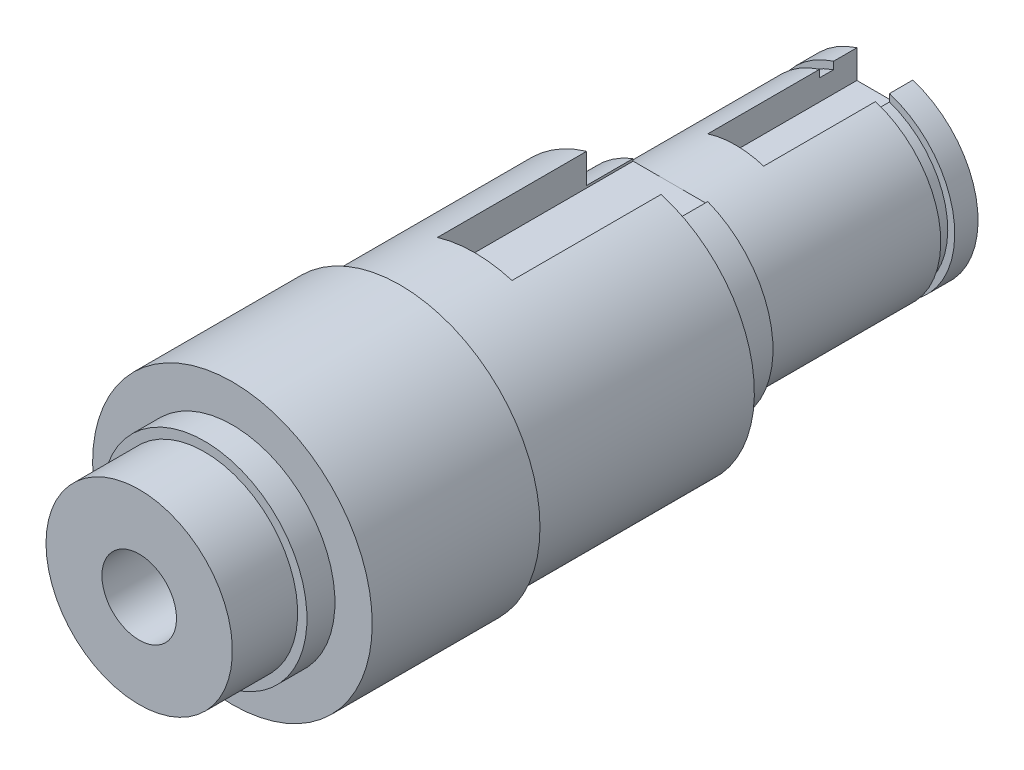
ISO-10303-21;
HEADER;
FILE_DESCRIPTION(('STEP AP214'),'2;1');
FILE_NAME('part.step','',(''),(''),'','','');
FILE_SCHEMA(('AUTOMOTIVE_DESIGN { 1 0 10303 214 1 1 1 1 }'));
ENDSEC;
DATA;
#1=APPLICATION_CONTEXT('core data for automotive mechanical design processes');
#2=APPLICATION_PROTOCOL_DEFINITION('international standard','automotive_design',2000,#1);
#3=PRODUCT_CONTEXT('',#1,'mechanical');
#4=PRODUCT('Part','Part','',(#3));
#5=PRODUCT_RELATED_PRODUCT_CATEGORY('part','',(#4));
#6=PRODUCT_DEFINITION_FORMATION('','',#4);
#7=PRODUCT_DEFINITION_CONTEXT('part definition',#1,'design');
#8=PRODUCT_DEFINITION('design','',#6,#7);
#9=PRODUCT_DEFINITION_SHAPE('','',#8);
#10=(LENGTH_UNIT() NAMED_UNIT(*) SI_UNIT(.MILLI.,.METRE.));
#11=(NAMED_UNIT(*) PLANE_ANGLE_UNIT() SI_UNIT($,.RADIAN.));
#12=(NAMED_UNIT(*) SI_UNIT($,.STERADIAN.) SOLID_ANGLE_UNIT());
#13=UNCERTAINTY_MEASURE_WITH_UNIT(LENGTH_MEASURE(1.E-05),#10,'distance_accuracy_value','');
#14=(GEOMETRIC_REPRESENTATION_CONTEXT(3) GLOBAL_UNCERTAINTY_ASSIGNED_CONTEXT((#13)) GLOBAL_UNIT_ASSIGNED_CONTEXT((#10,
#11,#12)) REPRESENTATION_CONTEXT('',''));
#15=CARTESIAN_POINT('',(0.,0.,0.));
#16=DIRECTION('',(0.,0.,1.));
#17=DIRECTION('',(1.,0.,0.));
#18=AXIS2_PLACEMENT_3D('',#15,#16,#17);
#19=CARTESIAN_POINT('',(0.,0.,-122.779357785201));
#20=DIRECTION('',(0.,0.,-1.));
#21=DIRECTION('',(-1.,0.,0.));
#22=AXIS2_PLACEMENT_3D('',#19,#20,#21);
#23=CYLINDRICAL_SURFACE('',#22,10.);
#24=CARTESIAN_POINT('',(0.,0.,-57.));
#25=DIRECTION('',(0.,0.,-1.));
#26=DIRECTION('',(-1.,0.,0.));
#27=AXIS2_PLACEMENT_3D('',#24,#25,#26);
#28=CIRCLE('',#27,10.);
#29=CARTESIAN_POINT('',(0.,10.,-57.));
#30=VERTEX_POINT('',#29);
#31=EDGE_CURVE('E279',#30,#30,#28,.T.);
#32=ORIENTED_EDGE('',*,*,#31,.T.);
#33=EDGE_LOOP('',(#32));
#34=FACE_BOUND('',#33,.T.);
#35=DIRECTION('',(0.,0.,-1.));
#36=VECTOR('',#35,1.);
#37=CARTESIAN_POINT('',(-3.,9.53939201416947,-64.));
#38=LINE('',#37,#36);
#39=CARTESIAN_POINT('',(-3.,9.53939201416947,-64.));
#40=VERTEX_POINT('',#39);
#41=CARTESIAN_POINT('',(-3.,9.53939201416946,-76.));
#42=VERTEX_POINT('',#41);
#43=EDGE_CURVE('E201',#40,#42,#38,.T.);
#44=ORIENTED_EDGE('',*,*,#43,.T.);
#45=CARTESIAN_POINT('',(0.,0.,-76.));
#46=DIRECTION('',(0.,0.,1.));
#47=DIRECTION('',(1.,0.,0.));
#48=AXIS2_PLACEMENT_3D('',#45,#46,#47);
#49=CIRCLE('',#48,10.);
#50=CARTESIAN_POINT('',(3.,9.53939201416946,-76.));
#51=VERTEX_POINT('',#50);
#52=EDGE_CURVE('E329',#42,#51,#49,.T.);
#53=ORIENTED_EDGE('',*,*,#52,.T.);
#54=DIRECTION('',(0.,0.,-1.));
#55=VECTOR('',#54,1.);
#56=CARTESIAN_POINT('',(3.,9.53939201416947,-64.));
#57=LINE('',#56,#55);
#58=CARTESIAN_POINT('',(3.,9.53939201416947,-64.));
#59=VERTEX_POINT('',#58);
#60=EDGE_CURVE('E196',#59,#51,#57,.T.);
#61=ORIENTED_EDGE('',*,*,#60,.F.);
#62=CARTESIAN_POINT('',(0.,0.,-64.));
#63=DIRECTION('',(0.,0.,-1.));
#64=DIRECTION('',(-1.,0.,0.));
#65=AXIS2_PLACEMENT_3D('',#62,#63,#64);
#66=CIRCLE('',#65,10.);
#67=EDGE_CURVE('E186',#40,#59,#66,.T.);
#68=ORIENTED_EDGE('',*,*,#67,.F.);
#69=EDGE_LOOP('',(#44,#53,#61,#68));
#70=FACE_BOUND('',#69,.T.);
#71=ADVANCED_FACE('F39',(#34,#70),#23,.T.);
#72=CARTESIAN_POINT('',(10.,0.,-80.));
#73=DIRECTION('',(0.,0.,1.));
#74=DIRECTION('',(1.,0.,0.));
#75=AXIS2_PLACEMENT_3D('',#72,#73,#74);
#76=PLANE('',#75);
#77=CARTESIAN_POINT('',(0.,0.,-80.));
#78=DIRECTION('',(0.,0.,-1.));
#79=DIRECTION('',(-1.,0.,0.));
#80=AXIS2_PLACEMENT_3D('',#77,#78,#79);
#81=CIRCLE('',#80,4.);
#82=CARTESIAN_POINT('',(-4.,0.,-80.));
#83=VERTEX_POINT('',#82);
#84=EDGE_CURVE('E287',#83,#83,#81,.T.);
#85=ORIENTED_EDGE('',*,*,#84,.F.);
#86=EDGE_LOOP('',(#85));
#87=FACE_BOUND('',#86,.T.);
#88=DIRECTION('',(0.,1.,0.));
#89=VECTOR('',#88,1.);
#90=CARTESIAN_POINT('',(3.,0.,-80.));
#91=LINE('',#90,#89);
#92=CARTESIAN_POINT('',(3.,6.5,-80.));
#93=VERTEX_POINT('',#92);
#94=CARTESIAN_POINT('',(3.,9.53939201416947,-80.));
#95=VERTEX_POINT('',#94);
#96=EDGE_CURVE('E168',#93,#95,#91,.T.);
#97=ORIENTED_EDGE('',*,*,#96,.T.);
#98=CARTESIAN_POINT('',(0.,0.,-80.));
#99=DIRECTION('',(0.,0.,-1.));
#100=DIRECTION('',(-1.,0.,0.));
#101=AXIS2_PLACEMENT_3D('',#98,#99,#100);
#102=CIRCLE('',#101,10.);
#103=CARTESIAN_POINT('',(-3.,9.53939201416947,-80.));
#104=VERTEX_POINT('',#103);
#105=EDGE_CURVE('E283',#95,#104,#102,.T.);
#106=ORIENTED_EDGE('',*,*,#105,.T.);
#107=DIRECTION('',(0.,1.,0.));
#108=VECTOR('',#107,1.);
#109=CARTESIAN_POINT('',(-3.,0.,-80.));
#110=LINE('',#109,#108);
#111=CARTESIAN_POINT('',(-3.,6.5,-80.));
#112=VERTEX_POINT('',#111);
#113=EDGE_CURVE('E181',#112,#104,#110,.T.);
#114=ORIENTED_EDGE('',*,*,#113,.F.);
#115=DIRECTION('',(-1.,0.,0.));
#116=VECTOR('',#115,1.);
#117=CARTESIAN_POINT('',(0.,6.5,-80.));
#118=LINE('',#117,#116);
#119=EDGE_CURVE('E173',#93,#112,#118,.T.);
#120=ORIENTED_EDGE('',*,*,#119,.F.);
#121=EDGE_LOOP('',(#97,#106,#114,#120));
#122=FACE_BOUND('',#121,.T.);
#123=ADVANCED_FACE('F357',(#87,#122),#76,.F.);
#124=CARTESIAN_POINT('',(3.,9.53939201416946,-77.5));
#125=VERTEX_POINT('',#124);
#126=EDGE_CURVE('E200',#125,#95,#57,.T.);
#127=ORIENTED_EDGE('',*,*,#126,.F.);
#128=CARTESIAN_POINT('',(0.,0.,-77.5));
#129=DIRECTION('',(0.,0.,1.));
#130=DIRECTION('',(1.,0.,0.));
#131=AXIS2_PLACEMENT_3D('',#128,#129,#130);
#132=CIRCLE('',#131,10.);
#133=CARTESIAN_POINT('',(-3.,9.53939201416946,-77.5));
#134=VERTEX_POINT('',#133);
#135=EDGE_CURVE('E147',#134,#125,#132,.T.);
#136=ORIENTED_EDGE('',*,*,#135,.F.);
#137=EDGE_CURVE('E205',#134,#104,#38,.T.);
#138=ORIENTED_EDGE('',*,*,#137,.T.);
#139=ORIENTED_EDGE('',*,*,#105,.F.);
#140=EDGE_LOOP('',(#127,#136,#138,#139));
#141=FACE_BOUND('',#140,.T.);
#142=ADVANCED_FACE('F326',(#141),#23,.T.);
#143=CARTESIAN_POINT('',(0.,0.,-122.779357785201));
#144=DIRECTION('',(0.,0.,-1.));
#145=DIRECTION('',(-1.,0.,0.));
#146=AXIS2_PLACEMENT_3D('',#143,#144,#145);
#147=CYLINDRICAL_SURFACE('',#146,11.);
#148=CARTESIAN_POINT('',(0.,0.,-9.99999999999999));
#149=DIRECTION('',(0.,0.,-1.));
#150=DIRECTION('',(-1.,0.,0.));
#151=AXIS2_PLACEMENT_3D('',#148,#149,#150);
#152=CIRCLE('',#151,11.);
#153=CARTESIAN_POINT('',(-11.,0.,-9.99999999999999));
#154=VERTEX_POINT('',#153);
#155=EDGE_CURVE('E251',#154,#154,#152,.T.);
#156=ORIENTED_EDGE('',*,*,#155,.F.);
#157=EDGE_LOOP('',(#156));
#158=FACE_BOUND('',#157,.T.);
#159=CARTESIAN_POINT('',(0.,0.,-7.00000000000001));
#160=DIRECTION('',(0.,0.,-1.));
#161=DIRECTION('',(-1.,0.,0.));
#162=AXIS2_PLACEMENT_3D('',#159,#160,#161);
#163=CIRCLE('',#162,11.);
#164=CARTESIAN_POINT('',(-11.,0.,-7.00000000000001));
#165=VERTEX_POINT('',#164);
#166=EDGE_CURVE('E303',#165,#165,#163,.T.);
#167=ORIENTED_EDGE('',*,*,#166,.T.);
#168=EDGE_LOOP('',(#167));
#169=FACE_BOUND('',#168,.T.);
#170=ADVANCED_FACE('F41',(#158,#169),#147,.T.);
#171=CARTESIAN_POINT('',(11.,0.,-7.));
#172=DIRECTION('',(0.,0.,-1.));
#173=DIRECTION('',(-1.,0.,0.));
#174=AXIS2_PLACEMENT_3D('',#171,#172,#173);
#175=PLANE('',#174);
#176=ORIENTED_EDGE('',*,*,#166,.F.);
#177=EDGE_LOOP('',(#176));
#178=FACE_BOUND('',#177,.T.);
#179=CARTESIAN_POINT('',(0.,0.,-7.00000000000001));
#180=DIRECTION('',(0.,0.,-1.));
#181=DIRECTION('',(-1.,0.,0.));
#182=AXIS2_PLACEMENT_3D('',#179,#180,#181);
#183=CIRCLE('',#182,10.);
#184=CARTESIAN_POINT('',(-10.,0.,-7.00000000000001));
#185=VERTEX_POINT('',#184);
#186=EDGE_CURVE('E299',#185,#185,#183,.T.);
#187=ORIENTED_EDGE('',*,*,#186,.T.);
#188=EDGE_LOOP('',(#187));
#189=FACE_BOUND('',#188,.T.);
#190=ADVANCED_FACE('F370',(#178,#189),#175,.F.);
#191=CARTESIAN_POINT('',(0.,0.,-122.779357785201));
#192=DIRECTION('',(0.,0.,-1.));
#193=DIRECTION('',(-1.,0.,0.));
#194=AXIS2_PLACEMENT_3D('',#191,#192,#193);
#195=CYLINDRICAL_SURFACE('',#194,10.);
#196=ORIENTED_EDGE('',*,*,#186,.F.);
#197=EDGE_LOOP('',(#196));
#198=FACE_BOUND('',#197,.T.);
#199=CARTESIAN_POINT('',(0.,0.,0.));
#200=DIRECTION('',(0.,0.,-1.));
#201=DIRECTION('',(-1.,0.,0.));
#202=AXIS2_PLACEMENT_3D('',#199,#200,#201);
#203=CIRCLE('',#202,10.);
#204=CARTESIAN_POINT('',(-10.,0.,0.));
#205=VERTEX_POINT('',#204);
#206=EDGE_CURVE('E295',#205,#205,#203,.T.);
#207=ORIENTED_EDGE('',*,*,#206,.T.);
#208=EDGE_LOOP('',(#207));
#209=FACE_BOUND('',#208,.T.);
#210=ADVANCED_FACE('F375',(#198,#209),#195,.T.);
#211=CARTESIAN_POINT('',(4.00000000000001,0.,0.));
#212=DIRECTION('',(0.,0.,-1.));
#213=DIRECTION('',(-1.,0.,0.));
#214=AXIS2_PLACEMENT_3D('',#211,#212,#213);
#215=PLANE('',#214);
#216=ORIENTED_EDGE('',*,*,#206,.F.);
#217=EDGE_LOOP('',(#216));
#218=FACE_BOUND('',#217,.T.);
#219=CARTESIAN_POINT('',(0.,0.,0.));
#220=DIRECTION('',(0.,0.,-1.));
#221=DIRECTION('',(-1.,0.,0.));
#222=AXIS2_PLACEMENT_3D('',#219,#220,#221);
#223=CIRCLE('',#222,4.00000000000001);
#224=CARTESIAN_POINT('',(-4.00000000000001,0.,0.));
#225=VERTEX_POINT('',#224);
#226=EDGE_CURVE('E291',#225,#225,#223,.T.);
#227=ORIENTED_EDGE('',*,*,#226,.T.);
#228=EDGE_LOOP('',(#227));
#229=FACE_BOUND('',#228,.T.);
#230=ADVANCED_FACE('F385',(#218,#229),#215,.F.);
#231=CARTESIAN_POINT('',(0.,0.,-122.779357785201));
#232=DIRECTION('',(0.,0.,-1.));
#233=DIRECTION('',(-1.,0.,0.));
#234=AXIS2_PLACEMENT_3D('',#231,#232,#233);
#235=CYLINDRICAL_SURFACE('',#234,4.00000000000001);
#236=ORIENTED_EDGE('',*,*,#226,.F.);
#237=EDGE_LOOP('',(#236));
#238=FACE_BOUND('',#237,.T.);
#239=ORIENTED_EDGE('',*,*,#84,.T.);
#240=EDGE_LOOP('',(#239));
#241=FACE_BOUND('',#240,.T.);
#242=ADVANCED_FACE('F391',(#238,#241),#235,.F.);
#243=CARTESIAN_POINT('',(11.,0.,-57.));
#244=DIRECTION('',(0.,0.,1.));
#245=DIRECTION('',(1.,0.,0.));
#246=AXIS2_PLACEMENT_3D('',#243,#244,#245);
#247=PLANE('',#246);
#248=DIRECTION('',(-1.,0.,0.));
#249=VECTOR('',#248,1.);
#250=CARTESIAN_POINT('',(11.,10.,-57.));
#251=LINE('',#250,#249);
#252=CARTESIAN_POINT('',(4.,10.,-57.));
#253=VERTEX_POINT('',#252);
#254=EDGE_CURVE('E318',#253,#30,#251,.T.);
#255=ORIENTED_EDGE('',*,*,#254,.F.);
#256=DIRECTION('',(0.,1.,0.));
#257=VECTOR('',#256,1.);
#258=CARTESIAN_POINT('',(4.,0.,-57.));
#259=LINE('',#258,#257);
#260=CARTESIAN_POINT('',(4.,10.2469507659596,-57.));
#261=VERTEX_POINT('',#260);
#262=EDGE_CURVE('E247',#253,#261,#259,.T.);
#263=ORIENTED_EDGE('',*,*,#262,.T.);
#264=CARTESIAN_POINT('',(0.,0.,-57.));
#265=DIRECTION('',(0.,0.,-1.));
#266=DIRECTION('',(-1.,0.,0.));
#267=AXIS2_PLACEMENT_3D('',#264,#265,#266);
#268=CIRCLE('',#267,11.);
#269=CARTESIAN_POINT('',(-4.,10.2469507659596,-57.));
#270=VERTEX_POINT('',#269);
#271=EDGE_CURVE('E275',#261,#270,#268,.T.);
#272=ORIENTED_EDGE('',*,*,#271,.T.);
#273=DIRECTION('',(0.,1.,0.));
#274=VECTOR('',#273,1.);
#275=CARTESIAN_POINT('',(-4.,0.,-57.));
#276=LINE('',#275,#274);
#277=CARTESIAN_POINT('',(-4.,10.,-57.));
#278=VERTEX_POINT('',#277);
#279=EDGE_CURVE('E236',#278,#270,#276,.T.);
#280=ORIENTED_EDGE('',*,*,#279,.F.);
#281=EDGE_CURVE('E315',#30,#278,#251,.T.);
#282=ORIENTED_EDGE('',*,*,#281,.F.);
#283=ORIENTED_EDGE('',*,*,#31,.F.);
#284=EDGE_LOOP('',(#255,#263,#272,#280,#282,#283));
#285=FACE_BOUND('',#284,.T.);
#286=ADVANCED_FACE('F397',(#285),#247,.F.);
#287=CARTESIAN_POINT('',(0.,0.,-122.779357785201));
#288=DIRECTION('',(0.,0.,-1.));
#289=DIRECTION('',(-1.,0.,0.));
#290=AXIS2_PLACEMENT_3D('',#287,#288,#289);
#291=CYLINDRICAL_SURFACE('',#290,11.);
#292=ORIENTED_EDGE('',*,*,#271,.F.);
#293=DIRECTION('',(0.,0.,-1.));
#294=VECTOR('',#293,1.);
#295=CARTESIAN_POINT('',(4.,10.2469507659596,-122.779357785201));
#296=LINE('',#295,#294);
#297=CARTESIAN_POINT('',(4.,10.2469507659596,-52.));
#298=VERTEX_POINT('',#297);
#299=EDGE_CURVE('E243',#261,#298,#296,.F.);
#300=ORIENTED_EDGE('',*,*,#299,.T.);
#301=CARTESIAN_POINT('',(0.,0.,-52.));
#302=DIRECTION('',(0.,0.,-1.));
#303=DIRECTION('',(-1.,0.,0.));
#304=AXIS2_PLACEMENT_3D('',#301,#302,#303);
#305=CIRCLE('',#304,11.);
#306=CARTESIAN_POINT('',(-4.,10.2469507659596,-52.));
#307=VERTEX_POINT('',#306);
#308=EDGE_CURVE('E271',#298,#307,#305,.T.);
#309=ORIENTED_EDGE('',*,*,#308,.T.);
#310=DIRECTION('',(0.,0.,-1.));
#311=VECTOR('',#310,1.);
#312=CARTESIAN_POINT('',(-4.,10.2469507659596,-122.779357785201));
#313=LINE('',#312,#311);
#314=EDGE_CURVE('E233',#270,#307,#313,.F.);
#315=ORIENTED_EDGE('',*,*,#314,.F.);
#316=EDGE_LOOP('',(#292,#300,#309,#315));
#317=FACE_BOUND('',#316,.T.);
#318=ADVANCED_FACE('F423',(#317),#291,.T.);
#319=CARTESIAN_POINT('',(14.,0.,-52.));
#320=DIRECTION('',(0.,0.,1.));
#321=DIRECTION('',(1.,0.,0.));
#322=AXIS2_PLACEMENT_3D('',#319,#320,#321);
#323=PLANE('',#322);
#324=ORIENTED_EDGE('',*,*,#308,.F.);
#325=DIRECTION('',(0.,1.,0.));
#326=VECTOR('',#325,1.);
#327=CARTESIAN_POINT('',(4.,0.,-52.));
#328=LINE('',#327,#326);
#329=CARTESIAN_POINT('',(4.,13.4164078649987,-52.));
#330=VERTEX_POINT('',#329);
#331=EDGE_CURVE('E239',#298,#330,#328,.T.);
#332=ORIENTED_EDGE('',*,*,#331,.T.);
#333=CARTESIAN_POINT('',(0.,0.,-52.));
#334=DIRECTION('',(0.,0.,-1.));
#335=DIRECTION('',(-1.,0.,0.));
#336=AXIS2_PLACEMENT_3D('',#333,#334,#335);
#337=CIRCLE('',#336,14.);
#338=CARTESIAN_POINT('',(-4.,13.4164078649987,-52.));
#339=VERTEX_POINT('',#338);
#340=EDGE_CURVE('E267',#330,#339,#337,.T.);
#341=ORIENTED_EDGE('',*,*,#340,.T.);
#342=DIRECTION('',(0.,1.,0.));
#343=VECTOR('',#342,1.);
#344=CARTESIAN_POINT('',(-4.,0.,-52.));
#345=LINE('',#344,#343);
#346=EDGE_CURVE('E230',#307,#339,#345,.T.);
#347=ORIENTED_EDGE('',*,*,#346,.F.);
#348=EDGE_LOOP('',(#324,#332,#341,#347));
#349=FACE_BOUND('',#348,.T.);
#350=ADVANCED_FACE('F426',(#349),#323,.F.);
#351=CARTESIAN_POINT('',(0.,0.,-122.779357785201));
#352=DIRECTION('',(0.,0.,-1.));
#353=DIRECTION('',(-1.,0.,0.));
#354=AXIS2_PLACEMENT_3D('',#351,#352,#353);
#355=CYLINDRICAL_SURFACE('',#354,14.);
#356=ORIENTED_EDGE('',*,*,#340,.F.);
#357=DIRECTION('',(0.,0.,-1.));
#358=VECTOR('',#357,1.);
#359=CARTESIAN_POINT('',(4.,13.4164078649987,-122.779357785201));
#360=LINE('',#359,#358);
#361=CARTESIAN_POINT('',(4.,13.4164078649987,-36.));
#362=VERTEX_POINT('',#361);
#363=EDGE_CURVE('E311',#330,#362,#360,.F.);
#364=ORIENTED_EDGE('',*,*,#363,.T.);
#365=CARTESIAN_POINT('',(0.,0.,-36.));
#366=DIRECTION('',(0.,0.,-1.));
#367=DIRECTION('',(-1.,0.,0.));
#368=AXIS2_PLACEMENT_3D('',#365,#366,#367);
#369=CIRCLE('',#368,14.);
#370=CARTESIAN_POINT('',(-4.,13.4164078649987,-36.));
#371=VERTEX_POINT('',#370);
#372=EDGE_CURVE('E220',#371,#362,#369,.T.);
#373=ORIENTED_EDGE('',*,*,#372,.F.);
#374=DIRECTION('',(0.,0.,-1.));
#375=VECTOR('',#374,1.);
#376=CARTESIAN_POINT('',(-4.,13.4164078649987,-122.779357785201));
#377=LINE('',#376,#375);
#378=EDGE_CURVE('E307',#339,#371,#377,.F.);
#379=ORIENTED_EDGE('',*,*,#378,.F.);
#380=EDGE_LOOP('',(#356,#364,#373,#379));
#381=FACE_BOUND('',#380,.T.);
#382=CARTESIAN_POINT('',(0.,0.,-28.));
#383=DIRECTION('',(0.,0.,-1.));
#384=DIRECTION('',(-1.,0.,0.));
#385=AXIS2_PLACEMENT_3D('',#382,#383,#384);
#386=CIRCLE('',#385,14.);
#387=CARTESIAN_POINT('',(-14.,0.,-28.));
#388=VERTEX_POINT('',#387);
#389=EDGE_CURVE('E263',#388,#388,#386,.T.);
#390=ORIENTED_EDGE('',*,*,#389,.T.);
#391=EDGE_LOOP('',(#390));
#392=FACE_BOUND('',#391,.T.);
#393=ADVANCED_FACE('F431',(#381,#392),#355,.T.);
#394=CARTESIAN_POINT('',(14.,0.,-28.));
#395=DIRECTION('',(0.,0.,1.));
#396=DIRECTION('',(1.,0.,0.));
#397=AXIS2_PLACEMENT_3D('',#394,#395,#396);
#398=PLANE('',#397);
#399=ORIENTED_EDGE('',*,*,#389,.F.);
#400=EDGE_LOOP('',(#399));
#401=FACE_BOUND('',#400,.T.);
#402=CARTESIAN_POINT('',(0.,0.,-28.));
#403=DIRECTION('',(0.,0.,-1.));
#404=DIRECTION('',(-1.,0.,0.));
#405=AXIS2_PLACEMENT_3D('',#402,#403,#404);
#406=CIRCLE('',#405,15.);
#407=CARTESIAN_POINT('',(-15.,0.,-28.));
#408=VERTEX_POINT('',#407);
#409=EDGE_CURVE('E259',#408,#408,#406,.T.);
#410=ORIENTED_EDGE('',*,*,#409,.T.);
#411=EDGE_LOOP('',(#410));
#412=FACE_BOUND('',#411,.T.);
#413=ADVANCED_FACE('F454',(#401,#412),#398,.F.);
#414=CARTESIAN_POINT('',(0.,0.,-122.779357785201));
#415=DIRECTION('',(0.,0.,-1.));
#416=DIRECTION('',(-1.,0.,0.));
#417=AXIS2_PLACEMENT_3D('',#414,#415,#416);
#418=CYLINDRICAL_SURFACE('',#417,15.);
#419=ORIENTED_EDGE('',*,*,#409,.F.);
#420=EDGE_LOOP('',(#419));
#421=FACE_BOUND('',#420,.T.);
#422=CARTESIAN_POINT('',(0.,0.,-9.99999999999999));
#423=DIRECTION('',(0.,0.,-1.));
#424=DIRECTION('',(-1.,0.,0.));
#425=AXIS2_PLACEMENT_3D('',#422,#423,#424);
#426=CIRCLE('',#425,15.);
#427=CARTESIAN_POINT('',(-15.,0.,-9.99999999999999));
#428=VERTEX_POINT('',#427);
#429=EDGE_CURVE('E255',#428,#428,#426,.T.);
#430=ORIENTED_EDGE('',*,*,#429,.T.);
#431=EDGE_LOOP('',(#430));
#432=FACE_BOUND('',#431,.T.);
#433=ADVANCED_FACE('F450',(#421,#432),#418,.T.);
#434=CARTESIAN_POINT('',(11.,0.,-10.));
#435=DIRECTION('',(0.,0.,-1.));
#436=DIRECTION('',(-1.,0.,0.));
#437=AXIS2_PLACEMENT_3D('',#434,#435,#436);
#438=PLANE('',#437);
#439=ORIENTED_EDGE('',*,*,#429,.F.);
#440=EDGE_LOOP('',(#439));
#441=FACE_BOUND('',#440,.T.);
#442=ORIENTED_EDGE('',*,*,#155,.T.);
#443=EDGE_LOOP('',(#442));
#444=FACE_BOUND('',#443,.T.);
#445=ADVANCED_FACE('F445',(#441,#444),#438,.F.);
#446=CARTESIAN_POINT('',(0.,10.,-62.));
#447=DIRECTION('',(0.,1.,0.));
#448=DIRECTION('',(0.,0.,1.));
#449=AXIS2_PLACEMENT_3D('',#446,#447,#448);
#450=PLANE('',#449);
#451=ORIENTED_EDGE('',*,*,#254,.T.);
#452=ORIENTED_EDGE('',*,*,#281,.T.);
#453=DIRECTION('',(0.,0.,1.));
#454=VECTOR('',#453,1.);
#455=CARTESIAN_POINT('',(-4.,10.,-62.));
#456=LINE('',#455,#454);
#457=CARTESIAN_POINT('',(-4.,10.,-36.));
#458=VERTEX_POINT('',#457);
#459=EDGE_CURVE('E224',#278,#458,#456,.T.);
#460=ORIENTED_EDGE('',*,*,#459,.T.);
#461=DIRECTION('',(-1.,0.,0.));
#462=VECTOR('',#461,1.);
#463=CARTESIAN_POINT('',(0.,10.,-36.));
#464=LINE('',#463,#462);
#465=CARTESIAN_POINT('',(4.,10.,-36.));
#466=VERTEX_POINT('',#465);
#467=EDGE_CURVE('E213',#466,#458,#464,.T.);
#468=ORIENTED_EDGE('',*,*,#467,.F.);
#469=DIRECTION('',(0.,0.,1.));
#470=VECTOR('',#469,1.);
#471=CARTESIAN_POINT('',(4.,10.,-62.));
#472=LINE('',#471,#470);
#473=EDGE_CURVE('E227',#253,#466,#472,.T.);
#474=ORIENTED_EDGE('',*,*,#473,.F.);
#475=EDGE_LOOP('',(#451,#452,#460,#468,#474));
#476=FACE_BOUND('',#475,.T.);
#477=ADVANCED_FACE('F410',(#476),#450,.T.);
#478=CARTESIAN_POINT('',(4.,0.,-62.));
#479=DIRECTION('',(1.,0.,0.));
#480=DIRECTION('',(0.,0.,-1.));
#481=AXIS2_PLACEMENT_3D('',#478,#479,#480);
#482=PLANE('',#481);
#483=ORIENTED_EDGE('',*,*,#473,.T.);
#484=DIRECTION('',(0.,1.,0.));
#485=VECTOR('',#484,1.);
#486=CARTESIAN_POINT('',(4.,0.,-36.));
#487=LINE('',#486,#485);
#488=EDGE_CURVE('E199',#466,#362,#487,.T.);
#489=ORIENTED_EDGE('',*,*,#488,.T.);
#490=ORIENTED_EDGE('',*,*,#363,.F.);
#491=ORIENTED_EDGE('',*,*,#331,.F.);
#492=ORIENTED_EDGE('',*,*,#299,.F.);
#493=ORIENTED_EDGE('',*,*,#262,.F.);
#494=EDGE_LOOP('',(#483,#489,#490,#491,#492,#493));
#495=FACE_BOUND('',#494,.T.);
#496=ADVANCED_FACE('F437',(#495),#482,.F.);
#497=CARTESIAN_POINT('',(-4.,0.,-62.));
#498=DIRECTION('',(1.,0.,0.));
#499=DIRECTION('',(0.,0.,-1.));
#500=AXIS2_PLACEMENT_3D('',#497,#498,#499);
#501=PLANE('',#500);
#502=ORIENTED_EDGE('',*,*,#279,.T.);
#503=ORIENTED_EDGE('',*,*,#314,.T.);
#504=ORIENTED_EDGE('',*,*,#346,.T.);
#505=ORIENTED_EDGE('',*,*,#378,.T.);
#506=DIRECTION('',(0.,1.,0.));
#507=VECTOR('',#506,1.);
#508=CARTESIAN_POINT('',(-4.,0.,-36.));
#509=LINE('',#508,#507);
#510=EDGE_CURVE('E217',#458,#371,#509,.T.);
#511=ORIENTED_EDGE('',*,*,#510,.F.);
#512=ORIENTED_EDGE('',*,*,#459,.F.);
#513=EDGE_LOOP('',(#502,#503,#504,#505,#511,#512));
#514=FACE_BOUND('',#513,.T.);
#515=ADVANCED_FACE('F419',(#514),#501,.T.);
#516=CARTESIAN_POINT('',(0.,0.,-36.));
#517=DIRECTION('',(0.,0.,-1.));
#518=DIRECTION('',(-1.,0.,0.));
#519=AXIS2_PLACEMENT_3D('',#516,#517,#518);
#520=PLANE('',#519);
#521=ORIENTED_EDGE('',*,*,#488,.F.);
#522=ORIENTED_EDGE('',*,*,#467,.T.);
#523=ORIENTED_EDGE('',*,*,#510,.T.);
#524=ORIENTED_EDGE('',*,*,#372,.T.);
#525=EDGE_LOOP('',(#521,#522,#523,#524));
#526=FACE_BOUND('',#525,.T.);
#527=ADVANCED_FACE('F435',(#526),#520,.T.);
#528=CARTESIAN_POINT('',(3.,0.,-64.));
#529=DIRECTION('',(-1.,0.,0.));
#530=DIRECTION('',(0.,-1.,0.));
#531=AXIS2_PLACEMENT_3D('',#528,#529,#530);
#532=PLANE('',#531);
#533=DIRECTION('',(0.,1.,0.));
#534=VECTOR('',#533,1.);
#535=CARTESIAN_POINT('',(3.,0.,-76.));
#536=LINE('',#535,#534);
#537=CARTESIAN_POINT('',(3.,8.75,-76.));
#538=VERTEX_POINT('',#537);
#539=EDGE_CURVE('E152',#538,#51,#536,.T.);
#540=ORIENTED_EDGE('',*,*,#539,.F.);
#541=DIRECTION('',(0.,0.,1.));
#542=VECTOR('',#541,1.);
#543=CARTESIAN_POINT('',(3.,8.75,11.7842399992171));
#544=LINE('',#543,#542);
#545=CARTESIAN_POINT('',(3.,8.75,-77.5));
#546=VERTEX_POINT('',#545);
#547=EDGE_CURVE('E158',#546,#538,#544,.T.);
#548=ORIENTED_EDGE('',*,*,#547,.F.);
#549=DIRECTION('',(0.,-1.,0.));
#550=VECTOR('',#549,1.);
#551=CARTESIAN_POINT('',(3.,0.,-77.5));
#552=LINE('',#551,#550);
#553=EDGE_CURVE('E144',#125,#546,#552,.T.);
#554=ORIENTED_EDGE('',*,*,#553,.F.);
#555=ORIENTED_EDGE('',*,*,#126,.T.);
#556=ORIENTED_EDGE('',*,*,#96,.F.);
#557=DIRECTION('',(0.,0.,-1.));
#558=VECTOR('',#557,1.);
#559=CARTESIAN_POINT('',(3.,6.5,-64.));
#560=LINE('',#559,#558);
#561=CARTESIAN_POINT('',(3.,6.5,-64.));
#562=VERTEX_POINT('',#561);
#563=EDGE_CURVE('E188',#562,#93,#560,.T.);
#564=ORIENTED_EDGE('',*,*,#563,.F.);
#565=DIRECTION('',(0.,1.,0.));
#566=VECTOR('',#565,1.);
#567=CARTESIAN_POINT('',(3.,0.,-64.));
#568=LINE('',#567,#566);
#569=EDGE_CURVE('E177',#562,#59,#568,.T.);
#570=ORIENTED_EDGE('',*,*,#569,.T.);
#571=ORIENTED_EDGE('',*,*,#60,.T.);
#572=EDGE_LOOP('',(#540,#548,#554,#555,#556,#564,#570,#571));
#573=FACE_BOUND('',#572,.T.);
#574=ADVANCED_FACE('F165',(#573),#532,.T.);
#575=CARTESIAN_POINT('',(-3.,0.,-64.));
#576=DIRECTION('',(-1.,0.,0.));
#577=DIRECTION('',(0.,-1.,0.));
#578=AXIS2_PLACEMENT_3D('',#575,#576,#577);
#579=PLANE('',#578);
#580=DIRECTION('',(0.,0.,1.));
#581=VECTOR('',#580,1.);
#582=CARTESIAN_POINT('',(-3.,8.75,11.7842399992171));
#583=LINE('',#582,#581);
#584=CARTESIAN_POINT('',(-3.,8.75,-77.5));
#585=VERTEX_POINT('',#584);
#586=CARTESIAN_POINT('',(-3.,8.75,-76.));
#587=VERTEX_POINT('',#586);
#588=EDGE_CURVE('E48',#585,#587,#583,.T.);
#589=ORIENTED_EDGE('',*,*,#588,.T.);
#590=DIRECTION('',(0.,1.,0.));
#591=VECTOR('',#590,1.);
#592=CARTESIAN_POINT('',(-3.,0.,-76.));
#593=LINE('',#592,#591);
#594=EDGE_CURVE('E11',#587,#42,#593,.T.);
#595=ORIENTED_EDGE('',*,*,#594,.T.);
#596=ORIENTED_EDGE('',*,*,#43,.F.);
#597=DIRECTION('',(0.,1.,0.));
#598=VECTOR('',#597,1.);
#599=CARTESIAN_POINT('',(-3.,0.,-64.));
#600=LINE('',#599,#598);
#601=CARTESIAN_POINT('',(-3.,6.5,-64.));
#602=VERTEX_POINT('',#601);
#603=EDGE_CURVE('E63',#602,#40,#600,.T.);
#604=ORIENTED_EDGE('',*,*,#603,.F.);
#605=DIRECTION('',(0.,0.,-1.));
#606=VECTOR('',#605,1.);
#607=CARTESIAN_POINT('',(-3.,6.5,-64.));
#608=LINE('',#607,#606);
#609=EDGE_CURVE('E206',#602,#112,#608,.T.);
#610=ORIENTED_EDGE('',*,*,#609,.T.);
#611=ORIENTED_EDGE('',*,*,#113,.T.);
#612=ORIENTED_EDGE('',*,*,#137,.F.);
#613=DIRECTION('',(0.,-1.,0.));
#614=VECTOR('',#613,1.);
#615=CARTESIAN_POINT('',(-3.,0.,-77.5));
#616=LINE('',#615,#614);
#617=EDGE_CURVE('E319',#134,#585,#616,.T.);
#618=ORIENTED_EDGE('',*,*,#617,.T.);
#619=EDGE_LOOP('',(#589,#595,#596,#604,#610,#611,#612,#618));
#620=FACE_BOUND('',#619,.T.);
#621=ADVANCED_FACE('F323',(#620),#579,.F.);
#622=CARTESIAN_POINT('',(0.,6.5,-64.));
#623=DIRECTION('',(0.,-1.,0.));
#624=DIRECTION('',(0.,0.,-1.));
#625=AXIS2_PLACEMENT_3D('',#622,#623,#624);
#626=PLANE('',#625);
#627=ORIENTED_EDGE('',*,*,#119,.T.);
#628=ORIENTED_EDGE('',*,*,#609,.F.);
#629=DIRECTION('',(-1.,0.,0.));
#630=VECTOR('',#629,1.);
#631=CARTESIAN_POINT('',(0.,6.5,-64.));
#632=LINE('',#631,#630);
#633=EDGE_CURVE('E180',#562,#602,#632,.T.);
#634=ORIENTED_EDGE('',*,*,#633,.F.);
#635=ORIENTED_EDGE('',*,*,#563,.T.);
#636=EDGE_LOOP('',(#627,#628,#634,#635));
#637=FACE_BOUND('',#636,.T.);
#638=ADVANCED_FACE('F346',(#637),#626,.F.);
#639=CARTESIAN_POINT('',(0.,0.,-64.));
#640=DIRECTION('',(0.,0.,-1.));
#641=DIRECTION('',(-1.,0.,0.));
#642=AXIS2_PLACEMENT_3D('',#639,#640,#641);
#643=PLANE('',#642);
#644=ORIENTED_EDGE('',*,*,#569,.F.);
#645=ORIENTED_EDGE('',*,*,#633,.T.);
#646=ORIENTED_EDGE('',*,*,#603,.T.);
#647=ORIENTED_EDGE('',*,*,#67,.T.);
#648=EDGE_LOOP('',(#644,#645,#646,#647));
#649=FACE_BOUND('',#648,.T.);
#650=ADVANCED_FACE('F344',(#649),#643,.T.);
#651=CARTESIAN_POINT('',(0.,0.,11.7842399992171));
#652=DIRECTION('',(0.,0.,1.));
#653=DIRECTION('',(1.,0.,0.));
#654=AXIS2_PLACEMENT_3D('',#651,#652,#653);
#655=CYLINDRICAL_SURFACE('',#654,9.25);
#656=ORIENTED_EDGE('',*,*,#547,.T.);
#657=CARTESIAN_POINT('',(0.,0.,-76.));
#658=DIRECTION('',(0.,0.,1.));
#659=DIRECTION('',(1.,0.,0.));
#660=AXIS2_PLACEMENT_3D('',#657,#658,#659);
#661=CIRCLE('',#660,9.25);
#662=EDGE_CURVE('E153',#587,#538,#661,.T.);
#663=ORIENTED_EDGE('',*,*,#662,.F.);
#664=ORIENTED_EDGE('',*,*,#588,.F.);
#665=CARTESIAN_POINT('',(0.,0.,-77.5));
#666=DIRECTION('',(0.,0.,1.));
#667=DIRECTION('',(1.,0.,0.));
#668=AXIS2_PLACEMENT_3D('',#665,#666,#667);
#669=CIRCLE('',#668,9.25);
#670=EDGE_CURVE('E55',#585,#546,#669,.T.);
#671=ORIENTED_EDGE('',*,*,#670,.T.);
#672=EDGE_LOOP('',(#656,#663,#664,#671));
#673=FACE_BOUND('',#672,.T.);
#674=ADVANCED_FACE('F156',(#673),#655,.T.);
#675=CARTESIAN_POINT('',(9.25,0.,-76.));
#676=DIRECTION('',(0.,0.,1.));
#677=DIRECTION('',(1.,0.,0.));
#678=AXIS2_PLACEMENT_3D('',#675,#676,#677);
#679=PLANE('',#678);
#680=ORIENTED_EDGE('',*,*,#539,.T.);
#681=ORIENTED_EDGE('',*,*,#52,.F.);
#682=ORIENTED_EDGE('',*,*,#594,.F.);
#683=ORIENTED_EDGE('',*,*,#662,.T.);
#684=EDGE_LOOP('',(#680,#681,#682,#683));
#685=FACE_BOUND('',#684,.T.);
#686=ADVANCED_FACE('F337',(#685),#679,.F.);
#687=CARTESIAN_POINT('',(9.25,0.,-77.5));
#688=DIRECTION('',(0.,0.,-1.));
#689=DIRECTION('',(-1.,0.,0.));
#690=AXIS2_PLACEMENT_3D('',#687,#688,#689);
#691=PLANE('',#690);
#692=ORIENTED_EDGE('',*,*,#553,.T.);
#693=ORIENTED_EDGE('',*,*,#670,.F.);
#694=ORIENTED_EDGE('',*,*,#617,.F.);
#695=ORIENTED_EDGE('',*,*,#135,.T.);
#696=EDGE_LOOP('',(#692,#693,#694,#695));
#697=FACE_BOUND('',#696,.T.);
#698=ADVANCED_FACE('F145',(#697),#691,.F.);
#699=CLOSED_SHELL('',(#71,#123,#142,#170,#190,#210,#230,#242,#286,#318,#350,#393,#413,#433,#445,
#477,#496,#515,#527,#574,#621,#638,#650,#674,#686,#698));
#700=MANIFOLD_SOLID_BREP('B2',#699);
#701=ADVANCED_BREP_SHAPE_REPRESENTATION('',(#18,#700),#14);
#702=SHAPE_DEFINITION_REPRESENTATION(#9,#701);
ENDSEC;
END-ISO-10303-21;
